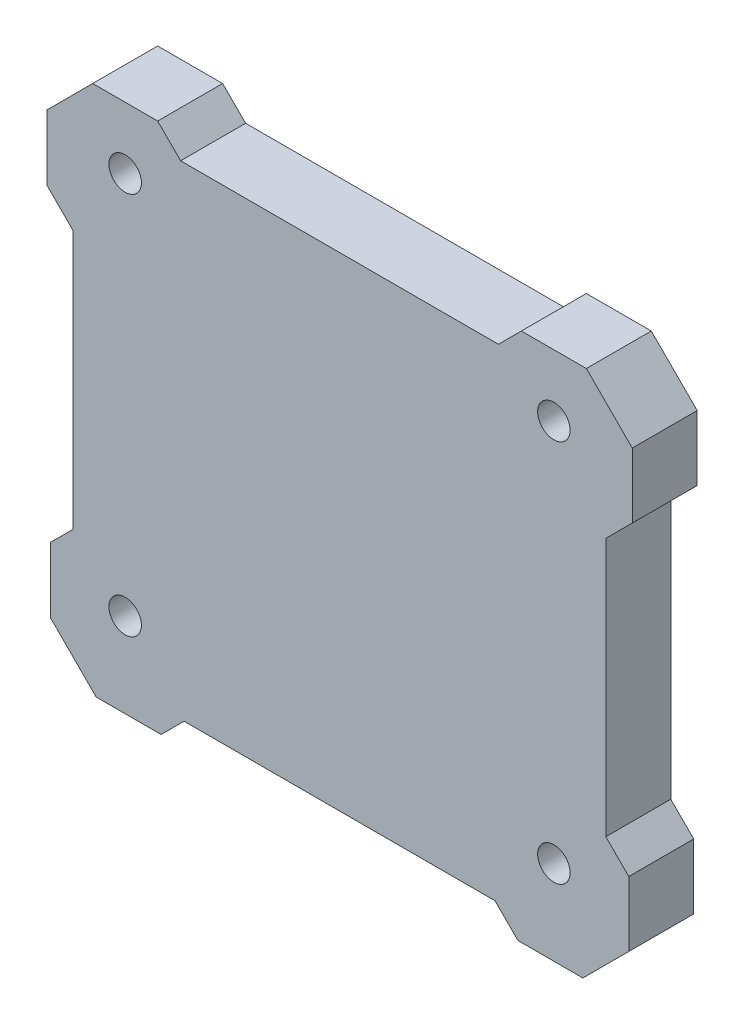
ISO-10303-21;
HEADER;
FILE_DESCRIPTION(('STEP AP214'),'2;1');
FILE_NAME('part.step','',(''),(''),'','','');
FILE_SCHEMA(('AUTOMOTIVE_DESIGN { 1 0 10303 214 1 1 1 1 }'));
ENDSEC;
DATA;
#1=APPLICATION_CONTEXT('core data for automotive mechanical design processes');
#2=APPLICATION_PROTOCOL_DEFINITION('international standard','automotive_design',2000,#1);
#3=PRODUCT_CONTEXT('',#1,'mechanical');
#4=PRODUCT('Part','Part','',(#3));
#5=PRODUCT_RELATED_PRODUCT_CATEGORY('part','',(#4));
#6=PRODUCT_DEFINITION_FORMATION('','',#4);
#7=PRODUCT_DEFINITION_CONTEXT('part definition',#1,'design');
#8=PRODUCT_DEFINITION('design','',#6,#7);
#9=PRODUCT_DEFINITION_SHAPE('','',#8);
#10=(LENGTH_UNIT() NAMED_UNIT(*) SI_UNIT(.MILLI.,.METRE.));
#11=(NAMED_UNIT(*) PLANE_ANGLE_UNIT() SI_UNIT($,.RADIAN.));
#12=(NAMED_UNIT(*) SI_UNIT($,.STERADIAN.) SOLID_ANGLE_UNIT());
#13=UNCERTAINTY_MEASURE_WITH_UNIT(LENGTH_MEASURE(1.E-05),#10,'distance_accuracy_value','');
#14=(GEOMETRIC_REPRESENTATION_CONTEXT(3) GLOBAL_UNCERTAINTY_ASSIGNED_CONTEXT((#13)) GLOBAL_UNIT_ASSIGNED_CONTEXT((#10,
#11,#12)) REPRESENTATION_CONTEXT('',''));
#15=CARTESIAN_POINT('',(0.,0.,0.));
#16=DIRECTION('',(0.,0.,1.));
#17=DIRECTION('',(1.,0.,0.));
#18=AXIS2_PLACEMENT_3D('',#15,#16,#17);
#19=CARTESIAN_POINT('',(0.,39.,10.));
#20=DIRECTION('',(0.,1.,0.));
#21=DIRECTION('',(0.,0.,1.));
#22=AXIS2_PLACEMENT_3D('',#19,#20,#21);
#23=PLANE('',#22);
#24=DIRECTION('',(1.,0.,0.));
#25=VECTOR('',#24,1.);
#26=CARTESIAN_POINT('',(0.,39.,10.));
#27=LINE('',#26,#25);
#28=CARTESIAN_POINT('',(28.,39.,10.));
#29=VERTEX_POINT('',#28);
#30=CARTESIAN_POINT('',(38.,39.,10.));
#31=VERTEX_POINT('',#30);
#32=EDGE_CURVE('E331',#29,#31,#27,.T.);
#33=ORIENTED_EDGE('',*,*,#32,.T.);
#34=DIRECTION('',(0.,0.,1.));
#35=VECTOR('',#34,1.);
#36=CARTESIAN_POINT('',(38.,39.,0.));
#37=LINE('',#36,#35);
#38=CARTESIAN_POINT('',(38.,39.,0.));
#39=VERTEX_POINT('',#38);
#40=EDGE_CURVE('E475',#39,#31,#37,.T.);
#41=ORIENTED_EDGE('',*,*,#40,.F.);
#42=DIRECTION('',(1.,0.,0.));
#43=VECTOR('',#42,1.);
#44=CARTESIAN_POINT('',(0.,39.,0.));
#45=LINE('',#44,#43);
#46=CARTESIAN_POINT('',(28.,39.,0.));
#47=VERTEX_POINT('',#46);
#48=EDGE_CURVE('E301',#47,#39,#45,.T.);
#49=ORIENTED_EDGE('',*,*,#48,.F.);
#50=DIRECTION('',(0.,0.,1.));
#51=VECTOR('',#50,1.);
#52=CARTESIAN_POINT('',(28.,39.,0.));
#53=LINE('',#52,#51);
#54=EDGE_CURVE('E533',#47,#29,#53,.T.);
#55=ORIENTED_EDGE('',*,*,#54,.T.);
#56=EDGE_LOOP('',(#33,#41,#49,#55));
#57=FACE_BOUND('',#56,.T.);
#58=ADVANCED_FACE('F113',(#57),#23,.T.);
#59=CARTESIAN_POINT('',(-38.,39.,10.));
#60=VERTEX_POINT('',#59);
#61=CARTESIAN_POINT('',(-28.,39.,10.));
#62=VERTEX_POINT('',#61);
#63=EDGE_CURVE('E293',#60,#62,#27,.T.);
#64=ORIENTED_EDGE('',*,*,#63,.T.);
#65=DIRECTION('',(0.,0.,1.));
#66=VECTOR('',#65,1.);
#67=CARTESIAN_POINT('',(-28.,39.,0.));
#68=LINE('',#67,#66);
#69=CARTESIAN_POINT('',(-28.,39.,0.));
#70=VERTEX_POINT('',#69);
#71=EDGE_CURVE('E279',#70,#62,#68,.T.);
#72=ORIENTED_EDGE('',*,*,#71,.F.);
#73=CARTESIAN_POINT('',(-38.,39.,0.));
#74=VERTEX_POINT('',#73);
#75=EDGE_CURVE('E291',#74,#70,#45,.T.);
#76=ORIENTED_EDGE('',*,*,#75,.F.);
#77=DIRECTION('',(0.,0.,1.));
#78=VECTOR('',#77,1.);
#79=CARTESIAN_POINT('',(-38.,39.,0.));
#80=LINE('',#79,#78);
#81=EDGE_CURVE('E295',#74,#60,#80,.T.);
#82=ORIENTED_EDGE('',*,*,#81,.T.);
#83=EDGE_LOOP('',(#64,#72,#76,#82));
#84=FACE_BOUND('',#83,.T.);
#85=ADVANCED_FACE('F289',(#84),#23,.T.);
#86=CARTESIAN_POINT('',(0.,0.,10.));
#87=DIRECTION('',(0.,0.,1.));
#88=DIRECTION('',(1.,0.,0.));
#89=AXIS2_PLACEMENT_3D('',#86,#87,#88);
#90=PLANE('',#89);
#91=CARTESIAN_POINT('',(-33.,-29.5,10.));
#92=DIRECTION('',(0.,0.,1.));
#93=DIRECTION('',(1.,0.,0.));
#94=AXIS2_PLACEMENT_3D('',#91,#92,#93);
#95=CIRCLE('',#94,2.5);
#96=CARTESIAN_POINT('',(-30.5,-29.5,10.));
#97=VERTEX_POINT('',#96);
#98=EDGE_CURVE('E351',#97,#97,#95,.T.);
#99=ORIENTED_EDGE('',*,*,#98,.F.);
#100=EDGE_LOOP('',(#99));
#101=FACE_BOUND('',#100,.T.);
#102=CARTESIAN_POINT('',(33.,-29.5,10.));
#103=DIRECTION('',(0.,0.,1.));
#104=DIRECTION('',(1.,0.,0.));
#105=AXIS2_PLACEMENT_3D('',#102,#103,#104);
#106=CIRCLE('',#105,2.5);
#107=CARTESIAN_POINT('',(35.5,-29.5,10.));
#108=VERTEX_POINT('',#107);
#109=EDGE_CURVE('E347',#108,#108,#106,.T.);
#110=ORIENTED_EDGE('',*,*,#109,.F.);
#111=EDGE_LOOP('',(#110));
#112=FACE_BOUND('',#111,.T.);
#113=CARTESIAN_POINT('',(-33.,29.5,10.));
#114=DIRECTION('',(0.,0.,1.));
#115=DIRECTION('',(1.,0.,0.));
#116=AXIS2_PLACEMENT_3D('',#113,#114,#115);
#117=CIRCLE('',#116,2.5);
#118=CARTESIAN_POINT('',(-30.5,29.5,10.));
#119=VERTEX_POINT('',#118);
#120=EDGE_CURVE('E343',#119,#119,#117,.T.);
#121=ORIENTED_EDGE('',*,*,#120,.F.);
#122=EDGE_LOOP('',(#121));
#123=FACE_BOUND('',#122,.T.);
#124=CARTESIAN_POINT('',(33.,29.5,10.));
#125=DIRECTION('',(0.,0.,1.));
#126=DIRECTION('',(1.,0.,0.));
#127=AXIS2_PLACEMENT_3D('',#124,#125,#126);
#128=CIRCLE('',#127,2.5);
#129=CARTESIAN_POINT('',(35.5,29.5,10.));
#130=VERTEX_POINT('',#129);
#131=EDGE_CURVE('E339',#130,#130,#128,.T.);
#132=ORIENTED_EDGE('',*,*,#131,.F.);
#133=EDGE_LOOP('',(#132));
#134=FACE_BOUND('',#133,.T.);
#135=DIRECTION('',(0.70710678118655,-0.707106781186545,0.));
#136=VECTOR('',#135,1.);
#137=CARTESIAN_POINT('',(38.4999999999999,38.5000000000001,10.));
#138=LINE('',#137,#136);
#139=CARTESIAN_POINT('',(45.0710678118655,31.9289321881346,10.));
#140=VERTEX_POINT('',#139);
#141=EDGE_CURVE('E429',#31,#140,#138,.T.);
#142=ORIENTED_EDGE('',*,*,#141,.F.);
#143=ORIENTED_EDGE('',*,*,#32,.F.);
#144=DIRECTION('',(-0.707106781186543,-0.707106781186552,0.));
#145=VECTOR('',#144,1.);
#146=CARTESIAN_POINT('',(28.,39.,10.));
#147=LINE('',#146,#145);
#148=CARTESIAN_POINT('',(24.4644660940673,35.4644660940673,10.));
#149=VERTEX_POINT('',#148);
#150=EDGE_CURVE('E284',#29,#149,#147,.T.);
#151=ORIENTED_EDGE('',*,*,#150,.T.);
#152=DIRECTION('',(-1.,0.,0.));
#153=VECTOR('',#152,1.);
#154=CARTESIAN_POINT('',(24.4644660940673,35.4644660940673,10.));
#155=LINE('',#154,#153);
#156=CARTESIAN_POINT('',(-24.4644660940673,35.4644660940673,10.));
#157=VERTEX_POINT('',#156);
#158=EDGE_CURVE('E543',#149,#157,#155,.T.);
#159=ORIENTED_EDGE('',*,*,#158,.T.);
#160=DIRECTION('',(-0.707106781186544,0.707106781186551,0.));
#161=VECTOR('',#160,1.);
#162=CARTESIAN_POINT('',(-28.,39.,10.));
#163=LINE('',#162,#161);
#164=EDGE_CURVE('E547',#157,#62,#163,.T.);
#165=ORIENTED_EDGE('',*,*,#164,.T.);
#166=ORIENTED_EDGE('',*,*,#63,.F.);
#167=DIRECTION('',(-0.70710678118655,-0.707106781186545,0.));
#168=VECTOR('',#167,1.);
#169=CARTESIAN_POINT('',(-38.4999999999999,38.5000000000001,10.));
#170=LINE('',#169,#168);
#171=CARTESIAN_POINT('',(-45.0710678118655,31.9289321881346,10.));
#172=VERTEX_POINT('',#171);
#173=EDGE_CURVE('E426',#60,#172,#170,.T.);
#174=ORIENTED_EDGE('',*,*,#173,.T.);
#175=DIRECTION('',(0.,-1.,0.));
#176=VECTOR('',#175,1.);
#177=CARTESIAN_POINT('',(-45.0710678118655,0.,10.));
#178=LINE('',#177,#176);
#179=CARTESIAN_POINT('',(-45.0710678118655,21.9289321881346,10.));
#180=VERTEX_POINT('',#179);
#181=EDGE_CURVE('E421',#172,#180,#178,.T.);
#182=ORIENTED_EDGE('',*,*,#181,.T.);
#183=DIRECTION('',(0.707106781186542,-0.707106781186554,0.));
#184=VECTOR('',#183,1.);
#185=CARTESIAN_POINT('',(-11.5710678118658,-11.5710678118656,10.));
#186=LINE('',#185,#184);
#187=CARTESIAN_POINT('',(-41.,17.857864376269,10.));
#188=VERTEX_POINT('',#187);
#189=EDGE_CURVE('E472',#180,#188,#186,.T.);
#190=ORIENTED_EDGE('',*,*,#189,.T.);
#191=DIRECTION('',(0.,-1.,0.));
#192=VECTOR('',#191,1.);
#193=CARTESIAN_POINT('',(-41.,0.,10.));
#194=LINE('',#193,#192);
#195=CARTESIAN_POINT('',(-41.,-21.9289321881344,10.));
#196=VERTEX_POINT('',#195);
#197=EDGE_CURVE('E123',#188,#196,#194,.T.);
#198=ORIENTED_EDGE('',*,*,#197,.T.);
#199=DIRECTION('',(0.707106781186546,0.70710678118655,0.));
#200=VECTOR('',#199,1.);
#201=CARTESIAN_POINT('',(-9.5355339059329,9.53553390593285,10.));
#202=LINE('',#201,#200);
#203=CARTESIAN_POINT('',(-44.5355339059328,-25.4644660940672,10.));
#204=VERTEX_POINT('',#203);
#205=EDGE_CURVE('E469',#204,#196,#202,.T.);
#206=ORIENTED_EDGE('',*,*,#205,.F.);
#207=DIRECTION('',(0.,1.,0.));
#208=VECTOR('',#207,1.);
#209=CARTESIAN_POINT('',(-44.5355339059327,0.,10.));
#210=LINE('',#209,#208);
#211=CARTESIAN_POINT('',(-44.5355339059328,-35.4644660940672,10.));
#212=VERTEX_POINT('',#211);
#213=EDGE_CURVE('E466',#212,#204,#210,.T.);
#214=ORIENTED_EDGE('',*,*,#213,.F.);
#215=DIRECTION('',(0.707106781186542,-0.707106781186553,0.));
#216=VECTOR('',#215,1.);
#217=CARTESIAN_POINT('',(-40.0000000000003,-39.9999999999997,10.));
#218=LINE('',#217,#216);
#219=CARTESIAN_POINT('',(-37.4644660940674,-42.5355339059327,10.));
#220=VERTEX_POINT('',#219);
#221=EDGE_CURVE('E463',#212,#220,#218,.T.);
#222=ORIENTED_EDGE('',*,*,#221,.T.);
#223=DIRECTION('',(1.,0.,0.));
#224=VECTOR('',#223,1.);
#225=CARTESIAN_POINT('',(0.,-42.5355339059328,10.));
#226=LINE('',#225,#224);
#227=CARTESIAN_POINT('',(-27.4644660940673,-42.5355339059327,10.));
#228=VERTEX_POINT('',#227);
#229=EDGE_CURVE('E459',#220,#228,#226,.T.);
#230=ORIENTED_EDGE('',*,*,#229,.T.);
#231=DIRECTION('',(0.707106781186552,0.707106781186543,0.));
#232=VECTOR('',#231,1.);
#233=CARTESIAN_POINT('',(7.53553390593289,-7.53553390593299,10.));
#234=LINE('',#233,#232);
#235=CARTESIAN_POINT('',(-23.9289321881345,-39.,10.));
#236=VERTEX_POINT('',#235);
#237=EDGE_CURVE('E456',#228,#236,#234,.T.);
#238=ORIENTED_EDGE('',*,*,#237,.T.);
#239=DIRECTION('',(1.,0.,0.));
#240=VECTOR('',#239,1.);
#241=CARTESIAN_POINT('',(0.,-39.,10.));
#242=LINE('',#241,#240);
#243=CARTESIAN_POINT('',(23.9289321881345,-39.,10.));
#244=VERTEX_POINT('',#243);
#245=EDGE_CURVE('E12',#236,#244,#242,.T.);
#246=ORIENTED_EDGE('',*,*,#245,.T.);
#247=DIRECTION('',(-0.707106781186553,0.707106781186542,0.));
#248=VECTOR('',#247,1.);
#249=CARTESIAN_POINT('',(-7.53553390593292,-7.53553390593303,10.));
#250=LINE('',#249,#248);
#251=CARTESIAN_POINT('',(27.4644660940673,-42.5355339059327,10.));
#252=VERTEX_POINT('',#251);
#253=EDGE_CURVE('E453',#252,#244,#250,.T.);
#254=ORIENTED_EDGE('',*,*,#253,.F.);
#255=DIRECTION('',(-1.,0.,0.));
#256=VECTOR('',#255,1.);
#257=CARTESIAN_POINT('',(0.,-42.5355339059328,10.));
#258=LINE('',#257,#256);
#259=CARTESIAN_POINT('',(37.4644660940673,-42.5355339059327,10.));
#260=VERTEX_POINT('',#259);
#261=EDGE_CURVE('E450',#260,#252,#258,.T.);
#262=ORIENTED_EDGE('',*,*,#261,.F.);
#263=DIRECTION('',(0.707106781186544,0.707106781186551,0.));
#264=VECTOR('',#263,1.);
#265=CARTESIAN_POINT('',(40.0000000000002,-39.9999999999998,10.));
#266=LINE('',#265,#264);
#267=CARTESIAN_POINT('',(44.5355339059327,-35.4644660940672,10.));
#268=VERTEX_POINT('',#267);
#269=EDGE_CURVE('E447',#260,#268,#266,.T.);
#270=ORIENTED_EDGE('',*,*,#269,.T.);
#271=DIRECTION('',(0.,1.,0.));
#272=VECTOR('',#271,1.);
#273=CARTESIAN_POINT('',(44.5355339059328,0.,10.));
#274=LINE('',#273,#272);
#275=CARTESIAN_POINT('',(44.5355339059327,-25.4644660940672,10.));
#276=VERTEX_POINT('',#275);
#277=EDGE_CURVE('E443',#268,#276,#274,.T.);
#278=ORIENTED_EDGE('',*,*,#277,.T.);
#279=DIRECTION('',(-0.707106781186543,0.707106781186552,0.));
#280=VECTOR('',#279,1.);
#281=CARTESIAN_POINT('',(9.53553390593301,9.5355339059329,10.));
#282=LINE('',#281,#280);
#283=CARTESIAN_POINT('',(41.,-21.9289321881345,10.));
#284=VERTEX_POINT('',#283);
#285=EDGE_CURVE('E439',#276,#284,#282,.T.);
#286=ORIENTED_EDGE('',*,*,#285,.T.);
#287=DIRECTION('',(0.,-1.,0.));
#288=VECTOR('',#287,1.);
#289=CARTESIAN_POINT('',(41.,0.,10.));
#290=LINE('',#289,#288);
#291=CARTESIAN_POINT('',(41.,17.857864376269,10.));
#292=VERTEX_POINT('',#291);
#293=EDGE_CURVE('E335',#292,#284,#290,.T.);
#294=ORIENTED_EDGE('',*,*,#293,.F.);
#295=DIRECTION('',(-0.707106781186543,-0.707106781186552,0.));
#296=VECTOR('',#295,1.);
#297=CARTESIAN_POINT('',(11.5710678118658,-11.5710678118656,10.));
#298=LINE('',#297,#296);
#299=CARTESIAN_POINT('',(45.0710678118655,21.9289321881346,10.));
#300=VERTEX_POINT('',#299);
#301=EDGE_CURVE('E435',#300,#292,#298,.T.);
#302=ORIENTED_EDGE('',*,*,#301,.F.);
#303=DIRECTION('',(0.,-1.,0.));
#304=VECTOR('',#303,1.);
#305=CARTESIAN_POINT('',(45.0710678118655,0.,10.));
#306=LINE('',#305,#304);
#307=EDGE_CURVE('E432',#140,#300,#306,.T.);
#308=ORIENTED_EDGE('',*,*,#307,.F.);
#309=EDGE_LOOP('',(#142,#143,#151,#159,#165,#166,#174,#182,#190,#198,#206,#214,#222,#230,#238,
#246,#254,#262,#270,#278,#286,#294,#302,#308));
#310=FACE_BOUND('',#309,.T.);
#311=ADVANCED_FACE('F646',(#101,#112,#123,#134,#310),#90,.T.);
#312=CARTESIAN_POINT('',(0.,0.,0.));
#313=DIRECTION('',(0.,0.,1.));
#314=DIRECTION('',(1.,0.,0.));
#315=AXIS2_PLACEMENT_3D('',#312,#313,#314);
#316=PLANE('',#315);
#317=CARTESIAN_POINT('',(-33.,-29.5,0.));
#318=DIRECTION('',(0.,0.,1.));
#319=DIRECTION('',(1.,0.,0.));
#320=AXIS2_PLACEMENT_3D('',#317,#318,#319);
#321=CIRCLE('',#320,2.5);
#322=CARTESIAN_POINT('',(-30.5,-29.5,0.));
#323=VERTEX_POINT('',#322);
#324=EDGE_CURVE('E323',#323,#323,#321,.T.);
#325=ORIENTED_EDGE('',*,*,#324,.T.);
#326=EDGE_LOOP('',(#325));
#327=FACE_BOUND('',#326,.T.);
#328=CARTESIAN_POINT('',(33.,-29.5,0.));
#329=DIRECTION('',(0.,0.,1.));
#330=DIRECTION('',(1.,0.,0.));
#331=AXIS2_PLACEMENT_3D('',#328,#329,#330);
#332=CIRCLE('',#331,2.5);
#333=CARTESIAN_POINT('',(35.5,-29.5,0.));
#334=VERTEX_POINT('',#333);
#335=EDGE_CURVE('E319',#334,#334,#332,.T.);
#336=ORIENTED_EDGE('',*,*,#335,.T.);
#337=EDGE_LOOP('',(#336));
#338=FACE_BOUND('',#337,.T.);
#339=CARTESIAN_POINT('',(-33.,29.5,0.));
#340=DIRECTION('',(0.,0.,1.));
#341=DIRECTION('',(1.,0.,0.));
#342=AXIS2_PLACEMENT_3D('',#339,#340,#341);
#343=CIRCLE('',#342,2.5);
#344=CARTESIAN_POINT('',(-30.5,29.5,0.));
#345=VERTEX_POINT('',#344);
#346=EDGE_CURVE('E315',#345,#345,#343,.T.);
#347=ORIENTED_EDGE('',*,*,#346,.T.);
#348=EDGE_LOOP('',(#347));
#349=FACE_BOUND('',#348,.T.);
#350=CARTESIAN_POINT('',(33.,29.5,0.));
#351=DIRECTION('',(0.,0.,1.));
#352=DIRECTION('',(1.,0.,0.));
#353=AXIS2_PLACEMENT_3D('',#350,#351,#352);
#354=CIRCLE('',#353,2.5);
#355=CARTESIAN_POINT('',(35.5,29.5,0.));
#356=VERTEX_POINT('',#355);
#357=EDGE_CURVE('E311',#356,#356,#354,.T.);
#358=ORIENTED_EDGE('',*,*,#357,.T.);
#359=EDGE_LOOP('',(#358));
#360=FACE_BOUND('',#359,.T.);
#361=ORIENTED_EDGE('',*,*,#48,.T.);
#362=DIRECTION('',(0.70710678118655,-0.707106781186545,0.));
#363=VECTOR('',#362,1.);
#364=CARTESIAN_POINT('',(38.4999999999999,38.5000000000001,0.));
#365=LINE('',#364,#363);
#366=CARTESIAN_POINT('',(45.0710678118655,31.9289321881346,0.));
#367=VERTEX_POINT('',#366);
#368=EDGE_CURVE('E481',#39,#367,#365,.T.);
#369=ORIENTED_EDGE('',*,*,#368,.T.);
#370=DIRECTION('',(0.,-1.,0.));
#371=VECTOR('',#370,1.);
#372=CARTESIAN_POINT('',(45.0710678118655,0.,0.));
#373=LINE('',#372,#371);
#374=CARTESIAN_POINT('',(45.0710678118655,21.9289321881346,0.));
#375=VERTEX_POINT('',#374);
#376=EDGE_CURVE('E484',#367,#375,#373,.T.);
#377=ORIENTED_EDGE('',*,*,#376,.T.);
#378=DIRECTION('',(-0.707106781186543,-0.707106781186552,0.));
#379=VECTOR('',#378,1.);
#380=CARTESIAN_POINT('',(11.5710678118658,-11.5710678118656,0.));
#381=LINE('',#380,#379);
#382=CARTESIAN_POINT('',(41.,17.857864376269,0.));
#383=VERTEX_POINT('',#382);
#384=EDGE_CURVE('E487',#375,#383,#381,.T.);
#385=ORIENTED_EDGE('',*,*,#384,.T.);
#386=DIRECTION('',(0.,-1.,0.));
#387=VECTOR('',#386,1.);
#388=CARTESIAN_POINT('',(41.,0.,0.));
#389=LINE('',#388,#387);
#390=CARTESIAN_POINT('',(41.,-21.9289321881345,0.));
#391=VERTEX_POINT('',#390);
#392=EDGE_CURVE('E306',#383,#391,#389,.T.);
#393=ORIENTED_EDGE('',*,*,#392,.T.);
#394=DIRECTION('',(-0.707106781186543,0.707106781186552,0.));
#395=VECTOR('',#394,1.);
#396=CARTESIAN_POINT('',(9.53553390593301,9.5355339059329,0.));
#397=LINE('',#396,#395);
#398=CARTESIAN_POINT('',(44.5355339059327,-25.4644660940672,0.));
#399=VERTEX_POINT('',#398);
#400=EDGE_CURVE('E491',#399,#391,#397,.T.);
#401=ORIENTED_EDGE('',*,*,#400,.F.);
#402=DIRECTION('',(0.,1.,0.));
#403=VECTOR('',#402,1.);
#404=CARTESIAN_POINT('',(44.5355339059328,0.,0.));
#405=LINE('',#404,#403);
#406=CARTESIAN_POINT('',(44.5355339059327,-35.4644660940672,0.));
#407=VERTEX_POINT('',#406);
#408=EDGE_CURVE('E494',#407,#399,#405,.T.);
#409=ORIENTED_EDGE('',*,*,#408,.F.);
#410=DIRECTION('',(0.707106781186544,0.707106781186551,0.));
#411=VECTOR('',#410,1.);
#412=CARTESIAN_POINT('',(40.0000000000002,-39.9999999999998,0.));
#413=LINE('',#412,#411);
#414=CARTESIAN_POINT('',(37.4644660940673,-42.5355339059327,0.));
#415=VERTEX_POINT('',#414);
#416=EDGE_CURVE('E498',#415,#407,#413,.T.);
#417=ORIENTED_EDGE('',*,*,#416,.F.);
#418=DIRECTION('',(-1.,0.,0.));
#419=VECTOR('',#418,1.);
#420=CARTESIAN_POINT('',(0.,-42.5355339059328,0.));
#421=LINE('',#420,#419);
#422=CARTESIAN_POINT('',(27.4644660940673,-42.5355339059327,0.));
#423=VERTEX_POINT('',#422);
#424=EDGE_CURVE('E501',#415,#423,#421,.T.);
#425=ORIENTED_EDGE('',*,*,#424,.T.);
#426=DIRECTION('',(-0.707106781186553,0.707106781186542,0.));
#427=VECTOR('',#426,1.);
#428=CARTESIAN_POINT('',(-7.53553390593292,-7.53553390593303,0.));
#429=LINE('',#428,#427);
#430=CARTESIAN_POINT('',(23.9289321881345,-39.,0.));
#431=VERTEX_POINT('',#430);
#432=EDGE_CURVE('E504',#423,#431,#429,.T.);
#433=ORIENTED_EDGE('',*,*,#432,.T.);
#434=DIRECTION('',(1.,0.,0.));
#435=VECTOR('',#434,1.);
#436=CARTESIAN_POINT('',(0.,-39.,0.));
#437=LINE('',#436,#435);
#438=CARTESIAN_POINT('',(-23.9289321881345,-39.,0.));
#439=VERTEX_POINT('',#438);
#440=EDGE_CURVE('E117',#439,#431,#437,.T.);
#441=ORIENTED_EDGE('',*,*,#440,.F.);
#442=DIRECTION('',(0.707106781186552,0.707106781186543,0.));
#443=VECTOR('',#442,1.);
#444=CARTESIAN_POINT('',(7.53553390593289,-7.53553390593299,0.));
#445=LINE('',#444,#443);
#446=CARTESIAN_POINT('',(-27.4644660940673,-42.5355339059327,0.));
#447=VERTEX_POINT('',#446);
#448=EDGE_CURVE('E507',#447,#439,#445,.T.);
#449=ORIENTED_EDGE('',*,*,#448,.F.);
#450=DIRECTION('',(1.,0.,0.));
#451=VECTOR('',#450,1.);
#452=CARTESIAN_POINT('',(0.,-42.5355339059328,0.));
#453=LINE('',#452,#451);
#454=CARTESIAN_POINT('',(-37.4644660940674,-42.5355339059327,0.));
#455=VERTEX_POINT('',#454);
#456=EDGE_CURVE('E510',#455,#447,#453,.T.);
#457=ORIENTED_EDGE('',*,*,#456,.F.);
#458=DIRECTION('',(0.707106781186542,-0.707106781186553,0.));
#459=VECTOR('',#458,1.);
#460=CARTESIAN_POINT('',(-40.0000000000003,-39.9999999999997,0.));
#461=LINE('',#460,#459);
#462=CARTESIAN_POINT('',(-44.5355339059328,-35.4644660940672,0.));
#463=VERTEX_POINT('',#462);
#464=EDGE_CURVE('E514',#463,#455,#461,.T.);
#465=ORIENTED_EDGE('',*,*,#464,.F.);
#466=DIRECTION('',(0.,1.,0.));
#467=VECTOR('',#466,1.);
#468=CARTESIAN_POINT('',(-44.5355339059327,0.,0.));
#469=LINE('',#468,#467);
#470=CARTESIAN_POINT('',(-44.5355339059328,-25.4644660940672,0.));
#471=VERTEX_POINT('',#470);
#472=EDGE_CURVE('E517',#463,#471,#469,.T.);
#473=ORIENTED_EDGE('',*,*,#472,.T.);
#474=DIRECTION('',(0.707106781186546,0.70710678118655,0.));
#475=VECTOR('',#474,1.);
#476=CARTESIAN_POINT('',(-9.5355339059329,9.53553390593285,0.));
#477=LINE('',#476,#475);
#478=CARTESIAN_POINT('',(-41.,-21.9289321881344,0.));
#479=VERTEX_POINT('',#478);
#480=EDGE_CURVE('E520',#471,#479,#477,.T.);
#481=ORIENTED_EDGE('',*,*,#480,.T.);
#482=DIRECTION('',(0.,-1.,0.));
#483=VECTOR('',#482,1.);
#484=CARTESIAN_POINT('',(-41.,0.,0.));
#485=LINE('',#484,#483);
#486=CARTESIAN_POINT('',(-41.,17.857864376269,0.));
#487=VERTEX_POINT('',#486);
#488=EDGE_CURVE('E300',#487,#479,#485,.T.);
#489=ORIENTED_EDGE('',*,*,#488,.F.);
#490=DIRECTION('',(0.707106781186542,-0.707106781186554,0.));
#491=VECTOR('',#490,1.);
#492=CARTESIAN_POINT('',(-11.5710678118658,-11.5710678118656,0.));
#493=LINE('',#492,#491);
#494=CARTESIAN_POINT('',(-45.0710678118655,21.9289321881346,0.));
#495=VERTEX_POINT('',#494);
#496=EDGE_CURVE('E425',#495,#487,#493,.T.);
#497=ORIENTED_EDGE('',*,*,#496,.F.);
#498=DIRECTION('',(0.,-1.,0.));
#499=VECTOR('',#498,1.);
#500=CARTESIAN_POINT('',(-45.0710678118655,0.,0.));
#501=LINE('',#500,#499);
#502=CARTESIAN_POINT('',(-45.0710678118655,31.9289321881346,0.));
#503=VERTEX_POINT('',#502);
#504=EDGE_CURVE('E360',#503,#495,#501,.T.);
#505=ORIENTED_EDGE('',*,*,#504,.F.);
#506=DIRECTION('',(-0.70710678118655,-0.707106781186545,0.));
#507=VECTOR('',#506,1.);
#508=CARTESIAN_POINT('',(-38.4999999999999,38.5000000000001,0.));
#509=LINE('',#508,#507);
#510=EDGE_CURVE('E139',#74,#503,#509,.T.);
#511=ORIENTED_EDGE('',*,*,#510,.F.);
#512=ORIENTED_EDGE('',*,*,#75,.T.);
#513=DIRECTION('',(-0.707106781186544,0.707106781186551,0.));
#514=VECTOR('',#513,1.);
#515=CARTESIAN_POINT('',(-28.,39.,0.));
#516=LINE('',#515,#514);
#517=CARTESIAN_POINT('',(-24.4644660940673,35.4644660940673,0.));
#518=VERTEX_POINT('',#517);
#519=EDGE_CURVE('E276',#518,#70,#516,.T.);
#520=ORIENTED_EDGE('',*,*,#519,.F.);
#521=DIRECTION('',(-1.,0.,0.));
#522=VECTOR('',#521,1.);
#523=CARTESIAN_POINT('',(24.4644660940673,35.4644660940673,0.));
#524=LINE('',#523,#522);
#525=CARTESIAN_POINT('',(24.4644660940673,35.4644660940673,0.));
#526=VERTEX_POINT('',#525);
#527=EDGE_CURVE('E283',#526,#518,#524,.T.);
#528=ORIENTED_EDGE('',*,*,#527,.F.);
#529=DIRECTION('',(-0.707106781186543,-0.707106781186552,0.));
#530=VECTOR('',#529,1.);
#531=CARTESIAN_POINT('',(28.,39.,0.));
#532=LINE('',#531,#530);
#533=EDGE_CURVE('E526',#47,#526,#532,.T.);
#534=ORIENTED_EDGE('',*,*,#533,.F.);
#535=EDGE_LOOP('',(#361,#369,#377,#385,#393,#401,#409,#417,#425,#433,#441,#449,#457,#465,#473,
#481,#489,#497,#505,#511,#512,#520,#528,#534));
#536=FACE_BOUND('',#535,.T.);
#537=ADVANCED_FACE('F298',(#327,#338,#349,#360,#536),#316,.F.);
#538=CARTESIAN_POINT('',(41.,0.,10.));
#539=DIRECTION('',(1.,0.,0.));
#540=DIRECTION('',(0.,0.,-1.));
#541=AXIS2_PLACEMENT_3D('',#538,#539,#540);
#542=PLANE('',#541);
#543=ORIENTED_EDGE('',*,*,#392,.F.);
#544=DIRECTION('',(0.,0.,1.));
#545=VECTOR('',#544,1.);
#546=CARTESIAN_POINT('',(41.,17.857864376269,0.));
#547=LINE('',#546,#545);
#548=EDGE_CURVE('E403',#383,#292,#547,.T.);
#549=ORIENTED_EDGE('',*,*,#548,.T.);
#550=ORIENTED_EDGE('',*,*,#293,.T.);
#551=DIRECTION('',(0.,0.,1.));
#552=VECTOR('',#551,1.);
#553=CARTESIAN_POINT('',(41.,-21.9289321881345,0.));
#554=LINE('',#553,#552);
#555=EDGE_CURVE('E400',#391,#284,#554,.T.);
#556=ORIENTED_EDGE('',*,*,#555,.F.);
#557=EDGE_LOOP('',(#543,#549,#550,#556));
#558=FACE_BOUND('',#557,.T.);
#559=ADVANCED_FACE('F577',(#558),#542,.T.);
#560=CARTESIAN_POINT('',(-41.,0.,10.));
#561=DIRECTION('',(1.,0.,0.));
#562=DIRECTION('',(0.,0.,-1.));
#563=AXIS2_PLACEMENT_3D('',#560,#561,#562);
#564=PLANE('',#563);
#565=ORIENTED_EDGE('',*,*,#197,.F.);
#566=DIRECTION('',(0.,0.,1.));
#567=VECTOR('',#566,1.);
#568=CARTESIAN_POINT('',(-41.,17.857864376269,0.));
#569=LINE('',#568,#567);
#570=EDGE_CURVE('E355',#487,#188,#569,.T.);
#571=ORIENTED_EDGE('',*,*,#570,.F.);
#572=ORIENTED_EDGE('',*,*,#488,.T.);
#573=DIRECTION('',(0.,0.,1.));
#574=VECTOR('',#573,1.);
#575=CARTESIAN_POINT('',(-41.,-21.9289321881344,0.));
#576=LINE('',#575,#574);
#577=EDGE_CURVE('E359',#479,#196,#576,.T.);
#578=ORIENTED_EDGE('',*,*,#577,.T.);
#579=EDGE_LOOP('',(#565,#571,#572,#578));
#580=FACE_BOUND('',#579,.T.);
#581=ADVANCED_FACE('F635',(#580),#564,.F.);
#582=CARTESIAN_POINT('',(0.,-39.,10.));
#583=DIRECTION('',(0.,1.,0.));
#584=DIRECTION('',(0.,0.,1.));
#585=AXIS2_PLACEMENT_3D('',#582,#583,#584);
#586=PLANE('',#585);
#587=DIRECTION('',(0.,0.,1.));
#588=VECTOR('',#587,1.);
#589=CARTESIAN_POINT('',(23.9289321881345,-39.,0.));
#590=LINE('',#589,#588);
#591=EDGE_CURVE('E382',#431,#244,#590,.T.);
#592=ORIENTED_EDGE('',*,*,#591,.T.);
#593=ORIENTED_EDGE('',*,*,#245,.F.);
#594=DIRECTION('',(0.,0.,1.));
#595=VECTOR('',#594,1.);
#596=CARTESIAN_POINT('',(-23.9289321881345,-39.,0.));
#597=LINE('',#596,#595);
#598=EDGE_CURVE('E378',#439,#236,#597,.T.);
#599=ORIENTED_EDGE('',*,*,#598,.F.);
#600=ORIENTED_EDGE('',*,*,#440,.T.);
#601=EDGE_LOOP('',(#592,#593,#599,#600));
#602=FACE_BOUND('',#601,.T.);
#603=ADVANCED_FACE('F606',(#602),#586,.F.);
#604=CARTESIAN_POINT('',(33.,29.5,10.));
#605=DIRECTION('',(0.,0.,-1.));
#606=DIRECTION('',(-1.,0.,0.));
#607=AXIS2_PLACEMENT_3D('',#604,#605,#606);
#608=CYLINDRICAL_SURFACE('',#607,2.5);
#609=ORIENTED_EDGE('',*,*,#131,.T.);
#610=EDGE_LOOP('',(#609));
#611=FACE_BOUND('',#610,.T.);
#612=ORIENTED_EDGE('',*,*,#357,.F.);
#613=EDGE_LOOP('',(#612));
#614=FACE_BOUND('',#613,.T.);
#615=ADVANCED_FACE('F664',(#611,#614),#608,.F.);
#616=CARTESIAN_POINT('',(-33.,29.5,10.));
#617=DIRECTION('',(0.,0.,-1.));
#618=DIRECTION('',(-1.,0.,0.));
#619=AXIS2_PLACEMENT_3D('',#616,#617,#618);
#620=CYLINDRICAL_SURFACE('',#619,2.5);
#621=ORIENTED_EDGE('',*,*,#120,.T.);
#622=EDGE_LOOP('',(#621));
#623=FACE_BOUND('',#622,.T.);
#624=ORIENTED_EDGE('',*,*,#346,.F.);
#625=EDGE_LOOP('',(#624));
#626=FACE_BOUND('',#625,.T.);
#627=ADVANCED_FACE('F667',(#623,#626),#620,.F.);
#628=CARTESIAN_POINT('',(33.,-29.5,10.));
#629=DIRECTION('',(0.,0.,-1.));
#630=DIRECTION('',(-1.,0.,0.));
#631=AXIS2_PLACEMENT_3D('',#628,#629,#630);
#632=CYLINDRICAL_SURFACE('',#631,2.5);
#633=ORIENTED_EDGE('',*,*,#109,.T.);
#634=EDGE_LOOP('',(#633));
#635=FACE_BOUND('',#634,.T.);
#636=ORIENTED_EDGE('',*,*,#335,.F.);
#637=EDGE_LOOP('',(#636));
#638=FACE_BOUND('',#637,.T.);
#639=ADVANCED_FACE('F670',(#635,#638),#632,.F.);
#640=CARTESIAN_POINT('',(-33.,-29.5,10.));
#641=DIRECTION('',(0.,0.,-1.));
#642=DIRECTION('',(-1.,0.,0.));
#643=AXIS2_PLACEMENT_3D('',#640,#641,#642);
#644=CYLINDRICAL_SURFACE('',#643,2.5);
#645=ORIENTED_EDGE('',*,*,#98,.T.);
#646=EDGE_LOOP('',(#645));
#647=FACE_BOUND('',#646,.T.);
#648=ORIENTED_EDGE('',*,*,#324,.F.);
#649=EDGE_LOOP('',(#648));
#650=FACE_BOUND('',#649,.T.);
#651=ADVANCED_FACE('F115',(#647,#650),#644,.F.);
#652=CARTESIAN_POINT('',(44.5355339059328,0.,0.));
#653=DIRECTION('',(1.,0.,0.));
#654=DIRECTION('',(0.,1.,0.));
#655=AXIS2_PLACEMENT_3D('',#652,#653,#654);
#656=PLANE('',#655);
#657=ORIENTED_EDGE('',*,*,#277,.F.);
#658=DIRECTION('',(0.,0.,1.));
#659=VECTOR('',#658,1.);
#660=CARTESIAN_POINT('',(44.5355339059327,-35.4644660940672,0.));
#661=LINE('',#660,#659);
#662=EDGE_CURVE('E393',#407,#268,#661,.T.);
#663=ORIENTED_EDGE('',*,*,#662,.F.);
#664=ORIENTED_EDGE('',*,*,#408,.T.);
#665=DIRECTION('',(0.,0.,1.));
#666=VECTOR('',#665,1.);
#667=CARTESIAN_POINT('',(44.5355339059327,-25.4644660940672,0.));
#668=LINE('',#667,#666);
#669=EDGE_CURVE('E397',#399,#276,#668,.T.);
#670=ORIENTED_EDGE('',*,*,#669,.T.);
#671=EDGE_LOOP('',(#657,#663,#664,#670));
#672=FACE_BOUND('',#671,.T.);
#673=ADVANCED_FACE('F586',(#672),#656,.T.);
#674=CARTESIAN_POINT('',(40.0000000000002,-39.9999999999998,0.));
#675=DIRECTION('',(0.707106781186551,-0.707106781186544,0.));
#676=DIRECTION('',(0.707106781186544,0.707106781186551,0.));
#677=AXIS2_PLACEMENT_3D('',#674,#675,#676);
#678=PLANE('',#677);
#679=ORIENTED_EDGE('',*,*,#416,.T.);
#680=ORIENTED_EDGE('',*,*,#662,.T.);
#681=ORIENTED_EDGE('',*,*,#269,.F.);
#682=DIRECTION('',(0.,0.,1.));
#683=VECTOR('',#682,1.);
#684=CARTESIAN_POINT('',(37.4644660940673,-42.5355339059327,0.));
#685=LINE('',#684,#683);
#686=EDGE_CURVE('E390',#415,#260,#685,.T.);
#687=ORIENTED_EDGE('',*,*,#686,.F.);
#688=EDGE_LOOP('',(#679,#680,#681,#687));
#689=FACE_BOUND('',#688,.T.);
#690=ADVANCED_FACE('F590',(#689),#678,.T.);
#691=CARTESIAN_POINT('',(0.,-42.5355339059328,0.));
#692=DIRECTION('',(0.,1.,0.));
#693=DIRECTION('',(-1.,0.,0.));
#694=AXIS2_PLACEMENT_3D('',#691,#692,#693);
#695=PLANE('',#694);
#696=ORIENTED_EDGE('',*,*,#261,.T.);
#697=DIRECTION('',(0.,0.,1.));
#698=VECTOR('',#697,1.);
#699=CARTESIAN_POINT('',(27.4644660940673,-42.5355339059327,0.));
#700=LINE('',#699,#698);
#701=EDGE_CURVE('E386',#423,#252,#700,.T.);
#702=ORIENTED_EDGE('',*,*,#701,.F.);
#703=ORIENTED_EDGE('',*,*,#424,.F.);
#704=ORIENTED_EDGE('',*,*,#686,.T.);
#705=EDGE_LOOP('',(#696,#702,#703,#704));
#706=FACE_BOUND('',#705,.T.);
#707=ADVANCED_FACE('F597',(#706),#695,.F.);
#708=CARTESIAN_POINT('',(-7.53553390593292,-7.53553390593303,0.));
#709=DIRECTION('',(0.707106781186542,0.707106781186553,0.));
#710=DIRECTION('',(-0.707106781186553,0.707106781186542,0.));
#711=AXIS2_PLACEMENT_3D('',#708,#709,#710);
#712=PLANE('',#711);
#713=ORIENTED_EDGE('',*,*,#253,.T.);
#714=ORIENTED_EDGE('',*,*,#591,.F.);
#715=ORIENTED_EDGE('',*,*,#432,.F.);
#716=ORIENTED_EDGE('',*,*,#701,.T.);
#717=EDGE_LOOP('',(#713,#714,#715,#716));
#718=FACE_BOUND('',#717,.T.);
#719=ADVANCED_FACE('F601',(#718),#712,.F.);
#720=CARTESIAN_POINT('',(9.53553390593301,9.5355339059329,0.));
#721=DIRECTION('',(0.707106781186552,0.707106781186543,0.));
#722=DIRECTION('',(-0.707106781186543,0.707106781186552,0.));
#723=AXIS2_PLACEMENT_3D('',#720,#721,#722);
#724=PLANE('',#723);
#725=ORIENTED_EDGE('',*,*,#285,.F.);
#726=ORIENTED_EDGE('',*,*,#669,.F.);
#727=ORIENTED_EDGE('',*,*,#400,.T.);
#728=ORIENTED_EDGE('',*,*,#555,.T.);
#729=EDGE_LOOP('',(#725,#726,#727,#728));
#730=FACE_BOUND('',#729,.T.);
#731=ADVANCED_FACE('F756',(#730),#724,.T.);
#732=CARTESIAN_POINT('',(0.,-42.5355339059328,0.));
#733=DIRECTION('',(0.,-1.,0.));
#734=DIRECTION('',(1.,0.,0.));
#735=AXIS2_PLACEMENT_3D('',#732,#733,#734);
#736=PLANE('',#735);
#737=ORIENTED_EDGE('',*,*,#229,.F.);
#738=DIRECTION('',(0.,0.,1.));
#739=VECTOR('',#738,1.);
#740=CARTESIAN_POINT('',(-37.4644660940674,-42.5355339059327,0.));
#741=LINE('',#740,#739);
#742=EDGE_CURVE('E371',#455,#220,#741,.T.);
#743=ORIENTED_EDGE('',*,*,#742,.F.);
#744=ORIENTED_EDGE('',*,*,#456,.T.);
#745=DIRECTION('',(0.,0.,1.));
#746=VECTOR('',#745,1.);
#747=CARTESIAN_POINT('',(-27.4644660940673,-42.5355339059327,0.));
#748=LINE('',#747,#746);
#749=EDGE_CURVE('E375',#447,#228,#748,.T.);
#750=ORIENTED_EDGE('',*,*,#749,.T.);
#751=EDGE_LOOP('',(#737,#743,#744,#750));
#752=FACE_BOUND('',#751,.T.);
#753=ADVANCED_FACE('F615',(#752),#736,.T.);
#754=CARTESIAN_POINT('',(-40.0000000000003,-39.9999999999997,0.));
#755=DIRECTION('',(-0.707106781186553,-0.707106781186542,0.));
#756=DIRECTION('',(0.707106781186542,-0.707106781186553,0.));
#757=AXIS2_PLACEMENT_3D('',#754,#755,#756);
#758=PLANE('',#757);
#759=ORIENTED_EDGE('',*,*,#742,.T.);
#760=ORIENTED_EDGE('',*,*,#221,.F.);
#761=DIRECTION('',(0.,0.,1.));
#762=VECTOR('',#761,1.);
#763=CARTESIAN_POINT('',(-44.5355339059328,-35.4644660940672,0.));
#764=LINE('',#763,#762);
#765=EDGE_CURVE('E368',#463,#212,#764,.T.);
#766=ORIENTED_EDGE('',*,*,#765,.F.);
#767=ORIENTED_EDGE('',*,*,#464,.T.);
#768=EDGE_LOOP('',(#759,#760,#766,#767));
#769=FACE_BOUND('',#768,.T.);
#770=ADVANCED_FACE('F619',(#769),#758,.T.);
#771=CARTESIAN_POINT('',(7.53553390593289,-7.53553390593299,0.));
#772=DIRECTION('',(0.707106781186543,-0.707106781186552,0.));
#773=DIRECTION('',(0.707106781186552,0.707106781186543,0.));
#774=AXIS2_PLACEMENT_3D('',#771,#772,#773);
#775=PLANE('',#774);
#776=ORIENTED_EDGE('',*,*,#237,.F.);
#777=ORIENTED_EDGE('',*,*,#749,.F.);
#778=ORIENTED_EDGE('',*,*,#448,.T.);
#779=ORIENTED_EDGE('',*,*,#598,.T.);
#780=EDGE_LOOP('',(#776,#777,#778,#779));
#781=FACE_BOUND('',#780,.T.);
#782=ADVANCED_FACE('F775',(#781),#775,.T.);
#783=CARTESIAN_POINT('',(-44.5355339059327,0.,0.));
#784=DIRECTION('',(1.,0.,0.));
#785=DIRECTION('',(0.,1.,0.));
#786=AXIS2_PLACEMENT_3D('',#783,#784,#785);
#787=PLANE('',#786);
#788=ORIENTED_EDGE('',*,*,#213,.T.);
#789=DIRECTION('',(0.,0.,1.));
#790=VECTOR('',#789,1.);
#791=CARTESIAN_POINT('',(-44.5355339059328,-25.4644660940672,0.));
#792=LINE('',#791,#790);
#793=EDGE_CURVE('E364',#471,#204,#792,.T.);
#794=ORIENTED_EDGE('',*,*,#793,.F.);
#795=ORIENTED_EDGE('',*,*,#472,.F.);
#796=ORIENTED_EDGE('',*,*,#765,.T.);
#797=EDGE_LOOP('',(#788,#794,#795,#796));
#798=FACE_BOUND('',#797,.T.);
#799=ADVANCED_FACE('F627',(#798),#787,.F.);
#800=CARTESIAN_POINT('',(-9.5355339059329,9.53553390593285,0.));
#801=DIRECTION('',(0.70710678118655,-0.707106781186546,0.));
#802=DIRECTION('',(0.707106781186546,0.70710678118655,0.));
#803=AXIS2_PLACEMENT_3D('',#800,#801,#802);
#804=PLANE('',#803);
#805=ORIENTED_EDGE('',*,*,#205,.T.);
#806=ORIENTED_EDGE('',*,*,#577,.F.);
#807=ORIENTED_EDGE('',*,*,#480,.F.);
#808=ORIENTED_EDGE('',*,*,#793,.T.);
#809=EDGE_LOOP('',(#805,#806,#807,#808));
#810=FACE_BOUND('',#809,.T.);
#811=ADVANCED_FACE('F631',(#810),#804,.F.);
#812=CARTESIAN_POINT('',(-45.0710678118655,0.,0.));
#813=DIRECTION('',(-1.,0.,0.));
#814=DIRECTION('',(0.,-1.,0.));
#815=AXIS2_PLACEMENT_3D('',#812,#813,#814);
#816=PLANE('',#815);
#817=ORIENTED_EDGE('',*,*,#181,.F.);
#818=DIRECTION('',(0.,0.,1.));
#819=VECTOR('',#818,1.);
#820=CARTESIAN_POINT('',(-45.0710678118655,31.9289321881346,0.));
#821=LINE('',#820,#819);
#822=EDGE_CURVE('E415',#503,#172,#821,.T.);
#823=ORIENTED_EDGE('',*,*,#822,.F.);
#824=ORIENTED_EDGE('',*,*,#504,.T.);
#825=DIRECTION('',(0.,0.,1.));
#826=VECTOR('',#825,1.);
#827=CARTESIAN_POINT('',(-45.0710678118655,21.9289321881346,0.));
#828=LINE('',#827,#826);
#829=EDGE_CURVE('E326',#495,#180,#828,.T.);
#830=ORIENTED_EDGE('',*,*,#829,.T.);
#831=EDGE_LOOP('',(#817,#823,#824,#830));
#832=FACE_BOUND('',#831,.T.);
#833=ADVANCED_FACE('F641',(#832),#816,.T.);
#834=CARTESIAN_POINT('',(-38.4999999999999,38.5000000000001,0.));
#835=DIRECTION('',(-0.707106781186545,0.70710678118655,0.));
#836=DIRECTION('',(-0.70710678118655,-0.707106781186545,0.));
#837=AXIS2_PLACEMENT_3D('',#834,#835,#836);
#838=PLANE('',#837);
#839=ORIENTED_EDGE('',*,*,#173,.F.);
#840=ORIENTED_EDGE('',*,*,#81,.F.);
#841=ORIENTED_EDGE('',*,*,#510,.T.);
#842=ORIENTED_EDGE('',*,*,#822,.T.);
#843=EDGE_LOOP('',(#839,#840,#841,#842));
#844=FACE_BOUND('',#843,.T.);
#845=ADVANCED_FACE('F644',(#844),#838,.T.);
#846=CARTESIAN_POINT('',(-11.5710678118658,-11.5710678118656,0.));
#847=DIRECTION('',(-0.707106781186554,-0.707106781186542,0.));
#848=DIRECTION('',(0.707106781186542,-0.707106781186554,0.));
#849=AXIS2_PLACEMENT_3D('',#846,#847,#848);
#850=PLANE('',#849);
#851=ORIENTED_EDGE('',*,*,#189,.F.);
#852=ORIENTED_EDGE('',*,*,#829,.F.);
#853=ORIENTED_EDGE('',*,*,#496,.T.);
#854=ORIENTED_EDGE('',*,*,#570,.T.);
#855=EDGE_LOOP('',(#851,#852,#853,#854));
#856=FACE_BOUND('',#855,.T.);
#857=ADVANCED_FACE('F807',(#856),#850,.T.);
#858=CARTESIAN_POINT('',(38.4999999999999,38.5000000000001,0.));
#859=DIRECTION('',(-0.707106781186545,-0.70710678118655,0.));
#860=DIRECTION('',(0.70710678118655,-0.707106781186545,0.));
#861=AXIS2_PLACEMENT_3D('',#858,#859,#860);
#862=PLANE('',#861);
#863=ORIENTED_EDGE('',*,*,#368,.F.);
#864=ORIENTED_EDGE('',*,*,#40,.T.);
#865=ORIENTED_EDGE('',*,*,#141,.T.);
#866=DIRECTION('',(0.,0.,1.));
#867=VECTOR('',#866,1.);
#868=CARTESIAN_POINT('',(45.0710678118655,31.9289321881346,0.));
#869=LINE('',#868,#867);
#870=EDGE_CURVE('E411',#367,#140,#869,.T.);
#871=ORIENTED_EDGE('',*,*,#870,.F.);
#872=EDGE_LOOP('',(#863,#864,#865,#871));
#873=FACE_BOUND('',#872,.T.);
#874=ADVANCED_FACE('F564',(#873),#862,.F.);
#875=CARTESIAN_POINT('',(45.0710678118655,0.,0.));
#876=DIRECTION('',(-1.,0.,0.));
#877=DIRECTION('',(0.,0.,1.));
#878=AXIS2_PLACEMENT_3D('',#875,#876,#877);
#879=PLANE('',#878);
#880=ORIENTED_EDGE('',*,*,#307,.T.);
#881=DIRECTION('',(0.,0.,1.));
#882=VECTOR('',#881,1.);
#883=CARTESIAN_POINT('',(45.0710678118655,21.9289321881346,0.));
#884=LINE('',#883,#882);
#885=EDGE_CURVE('E407',#375,#300,#884,.T.);
#886=ORIENTED_EDGE('',*,*,#885,.F.);
#887=ORIENTED_EDGE('',*,*,#376,.F.);
#888=ORIENTED_EDGE('',*,*,#870,.T.);
#889=EDGE_LOOP('',(#880,#886,#887,#888));
#890=FACE_BOUND('',#889,.T.);
#891=ADVANCED_FACE('F571',(#890),#879,.F.);
#892=CARTESIAN_POINT('',(11.5710678118658,-11.5710678118656,0.));
#893=DIRECTION('',(-0.707106781186552,0.707106781186543,0.));
#894=DIRECTION('',(-0.707106781186543,-0.707106781186552,0.));
#895=AXIS2_PLACEMENT_3D('',#892,#893,#894);
#896=PLANE('',#895);
#897=ORIENTED_EDGE('',*,*,#301,.T.);
#898=ORIENTED_EDGE('',*,*,#548,.F.);
#899=ORIENTED_EDGE('',*,*,#384,.F.);
#900=ORIENTED_EDGE('',*,*,#885,.T.);
#901=EDGE_LOOP('',(#897,#898,#899,#900));
#902=FACE_BOUND('',#901,.T.);
#903=ADVANCED_FACE('F575',(#902),#896,.F.);
#904=CARTESIAN_POINT('',(-28.,39.,0.));
#905=DIRECTION('',(0.707106781186551,0.707106781186544,0.));
#906=DIRECTION('',(-0.707106781186544,0.707106781186551,0.));
#907=AXIS2_PLACEMENT_3D('',#904,#905,#906);
#908=PLANE('',#907);
#909=ORIENTED_EDGE('',*,*,#164,.F.);
#910=DIRECTION('',(0.,0.,1.));
#911=VECTOR('',#910,1.);
#912=CARTESIAN_POINT('',(-24.4644660940673,35.4644660940673,0.));
#913=LINE('',#912,#911);
#914=EDGE_CURVE('E131',#518,#157,#913,.T.);
#915=ORIENTED_EDGE('',*,*,#914,.F.);
#916=ORIENTED_EDGE('',*,*,#519,.T.);
#917=ORIENTED_EDGE('',*,*,#71,.T.);
#918=EDGE_LOOP('',(#909,#915,#916,#917));
#919=FACE_BOUND('',#918,.T.);
#920=ADVANCED_FACE('F278',(#919),#908,.T.);
#921=CARTESIAN_POINT('',(24.4644660940673,35.4644660940673,0.));
#922=DIRECTION('',(0.,1.,0.));
#923=DIRECTION('',(-1.,0.,0.));
#924=AXIS2_PLACEMENT_3D('',#921,#922,#923);
#925=PLANE('',#924);
#926=ORIENTED_EDGE('',*,*,#158,.F.);
#927=DIRECTION('',(0.,0.,1.));
#928=VECTOR('',#927,1.);
#929=CARTESIAN_POINT('',(24.4644660940673,35.4644660940673,0.));
#930=LINE('',#929,#928);
#931=EDGE_CURVE('E530',#526,#149,#930,.T.);
#932=ORIENTED_EDGE('',*,*,#931,.F.);
#933=ORIENTED_EDGE('',*,*,#527,.T.);
#934=ORIENTED_EDGE('',*,*,#914,.T.);
#935=EDGE_LOOP('',(#926,#932,#933,#934));
#936=FACE_BOUND('',#935,.T.);
#937=ADVANCED_FACE('F556',(#936),#925,.T.);
#938=CARTESIAN_POINT('',(28.,39.,0.));
#939=DIRECTION('',(-0.707106781186552,0.707106781186543,0.));
#940=DIRECTION('',(-0.707106781186543,-0.707106781186552,0.));
#941=AXIS2_PLACEMENT_3D('',#938,#939,#940);
#942=PLANE('',#941);
#943=ORIENTED_EDGE('',*,*,#150,.F.);
#944=ORIENTED_EDGE('',*,*,#54,.F.);
#945=ORIENTED_EDGE('',*,*,#533,.T.);
#946=ORIENTED_EDGE('',*,*,#931,.T.);
#947=EDGE_LOOP('',(#943,#944,#945,#946));
#948=FACE_BOUND('',#947,.T.);
#949=ADVANCED_FACE('F647',(#948),#942,.T.);
#950=CLOSED_SHELL('',(#58,#85,#311,#537,#559,#581,#603,#615,#627,#639,#651,#673,#690,#707,#719,
#731,#753,#770,#782,#799,#811,#833,#845,#857,#874,#891,#903,#920,#937,#949));
#951=MANIFOLD_SOLID_BREP('B2',#950);
#952=ADVANCED_BREP_SHAPE_REPRESENTATION('',(#18,#951),#14);
#953=SHAPE_DEFINITION_REPRESENTATION(#9,#952);
ENDSEC;
END-ISO-10303-21;
